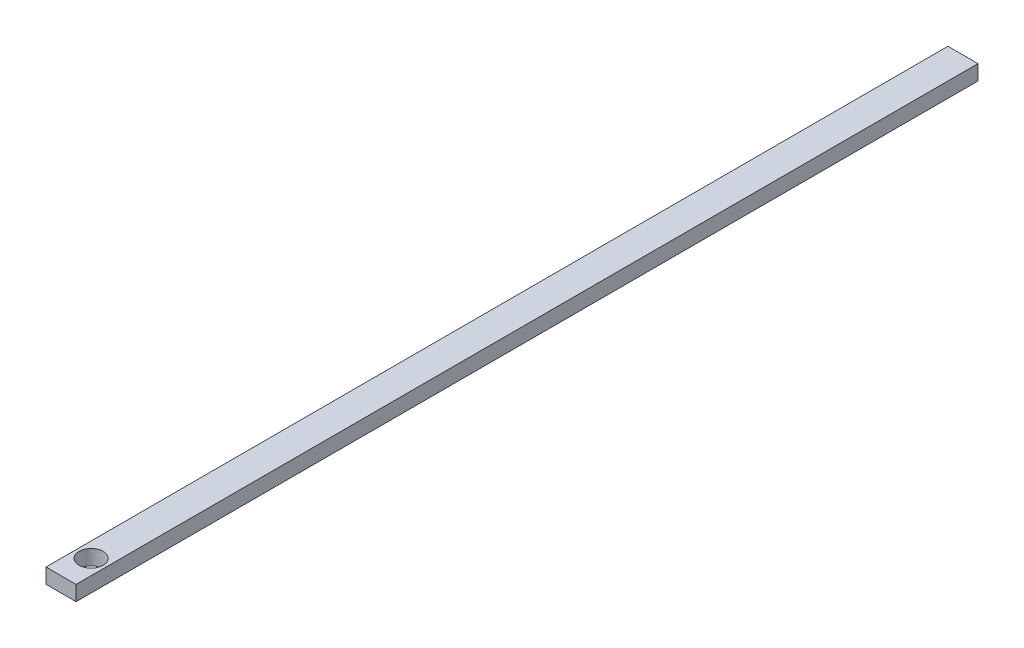
ISO-10303-21;
HEADER;
FILE_DESCRIPTION(('STEP AP214'),'2;1');
FILE_NAME('part.step','',(''),(''),'','','');
FILE_SCHEMA(('AUTOMOTIVE_DESIGN { 1 0 10303 214 1 1 1 1 }'));
ENDSEC;
DATA;
#1=APPLICATION_CONTEXT('core data for automotive mechanical design processes');
#2=APPLICATION_PROTOCOL_DEFINITION('international standard','automotive_design',2000,#1);
#3=PRODUCT_CONTEXT('',#1,'mechanical');
#4=PRODUCT('Part','Part','',(#3));
#5=PRODUCT_RELATED_PRODUCT_CATEGORY('part','',(#4));
#6=PRODUCT_DEFINITION_FORMATION('','',#4);
#7=PRODUCT_DEFINITION_CONTEXT('part definition',#1,'design');
#8=PRODUCT_DEFINITION('design','',#6,#7);
#9=PRODUCT_DEFINITION_SHAPE('','',#8);
#10=(LENGTH_UNIT() NAMED_UNIT(*) SI_UNIT(.MILLI.,.METRE.));
#11=(NAMED_UNIT(*) PLANE_ANGLE_UNIT() SI_UNIT($,.RADIAN.));
#12=(NAMED_UNIT(*) SI_UNIT($,.STERADIAN.) SOLID_ANGLE_UNIT());
#13=UNCERTAINTY_MEASURE_WITH_UNIT(LENGTH_MEASURE(1.E-05),#10,'distance_accuracy_value','');
#14=(GEOMETRIC_REPRESENTATION_CONTEXT(3) GLOBAL_UNCERTAINTY_ASSIGNED_CONTEXT((#13)) GLOBAL_UNIT_ASSIGNED_CONTEXT((#10,
#11,#12)) REPRESENTATION_CONTEXT('',''));
#15=CARTESIAN_POINT('',(0.,0.,0.));
#16=DIRECTION('',(0.,0.,1.));
#17=DIRECTION('',(1.,0.,0.));
#18=AXIS2_PLACEMENT_3D('',#15,#16,#17);
#19=CARTESIAN_POINT('',(10.,-2.5,150.));
#20=DIRECTION('',(0.,0.,1.));
#21=DIRECTION('',(1.,0.,0.));
#22=AXIS2_PLACEMENT_3D('',#19,#20,#21);
#23=PLANE('',#22);
#24=DIRECTION('',(0.,1.,0.));
#25=VECTOR('',#24,1.);
#26=CARTESIAN_POINT('',(0.,-2.5,150.));
#27=LINE('',#26,#25);
#28=CARTESIAN_POINT('',(0.,-2.5,150.));
#29=VERTEX_POINT('',#28);
#30=CARTESIAN_POINT('',(0.,2.5,150.));
#31=VERTEX_POINT('',#30);
#32=EDGE_CURVE('E105',#29,#31,#27,.T.);
#33=ORIENTED_EDGE('',*,*,#32,.F.);
#34=DIRECTION('',(-1.,0.,0.));
#35=VECTOR('',#34,1.);
#36=CARTESIAN_POINT('',(10.,-2.5,150.));
#37=LINE('',#36,#35);
#38=CARTESIAN_POINT('',(10.,-2.5,150.));
#39=VERTEX_POINT('',#38);
#40=EDGE_CURVE('E11',#39,#29,#37,.T.);
#41=ORIENTED_EDGE('',*,*,#40,.F.);
#42=DIRECTION('',(0.,1.,0.));
#43=VECTOR('',#42,1.);
#44=CARTESIAN_POINT('',(10.,-2.5,150.));
#45=LINE('',#44,#43);
#46=CARTESIAN_POINT('',(10.,2.5,150.));
#47=VERTEX_POINT('',#46);
#48=EDGE_CURVE('E99',#39,#47,#45,.T.);
#49=ORIENTED_EDGE('',*,*,#48,.T.);
#50=DIRECTION('',(-1.,0.,0.));
#51=VECTOR('',#50,1.);
#52=CARTESIAN_POINT('',(10.,2.5,150.));
#53=LINE('',#52,#51);
#54=EDGE_CURVE('E42',#47,#31,#53,.T.);
#55=ORIENTED_EDGE('',*,*,#54,.T.);
#56=EDGE_LOOP('',(#33,#41,#49,#55));
#57=FACE_BOUND('',#56,.T.);
#58=ADVANCED_FACE('F39',(#57),#23,.T.);
#59=CARTESIAN_POINT('',(10.,-2.5,150.));
#60=DIRECTION('',(0.,1.,0.));
#61=DIRECTION('',(0.,0.,1.));
#62=AXIS2_PLACEMENT_3D('',#59,#60,#61);
#63=PLANE('',#62);
#64=CARTESIAN_POINT('',(5.,-2.5,140.));
#65=DIRECTION('',(0.,1.,0.));
#66=DIRECTION('',(0.,0.,1.));
#67=AXIS2_PLACEMENT_3D('',#64,#65,#66);
#68=CIRCLE('',#67,4.);
#69=CARTESIAN_POINT('',(5.,-2.5,144.));
#70=VERTEX_POINT('',#69);
#71=EDGE_CURVE('E109',#70,#70,#68,.T.);
#72=ORIENTED_EDGE('',*,*,#71,.T.);
#73=EDGE_LOOP('',(#72));
#74=FACE_BOUND('',#73,.T.);
#75=DIRECTION('',(0.,0.,-1.));
#76=VECTOR('',#75,1.);
#77=CARTESIAN_POINT('',(0.,-2.5,150.));
#78=LINE('',#77,#76);
#79=CARTESIAN_POINT('',(0.,-2.5,-150.));
#80=VERTEX_POINT('',#79);
#81=EDGE_CURVE('E72',#29,#80,#78,.T.);
#82=ORIENTED_EDGE('',*,*,#81,.T.);
#83=DIRECTION('',(-1.,0.,0.));
#84=VECTOR('',#83,1.);
#85=CARTESIAN_POINT('',(10.,-2.5,-150.));
#86=LINE('',#85,#84);
#87=CARTESIAN_POINT('',(10.,-2.5,-150.));
#88=VERTEX_POINT('',#87);
#89=EDGE_CURVE('E48',#88,#80,#86,.T.);
#90=ORIENTED_EDGE('',*,*,#89,.F.);
#91=DIRECTION('',(0.,0.,-1.));
#92=VECTOR('',#91,1.);
#93=CARTESIAN_POINT('',(10.,-2.5,150.));
#94=LINE('',#93,#92);
#95=EDGE_CURVE('E89',#39,#88,#94,.T.);
#96=ORIENTED_EDGE('',*,*,#95,.F.);
#97=ORIENTED_EDGE('',*,*,#40,.T.);
#98=EDGE_LOOP('',(#82,#90,#96,#97));
#99=FACE_BOUND('',#98,.T.);
#100=ADVANCED_FACE('F116',(#74,#99),#63,.F.);
#101=CARTESIAN_POINT('',(10.,-2.5,-150.));
#102=DIRECTION('',(0.,0.,1.));
#103=DIRECTION('',(1.,0.,0.));
#104=AXIS2_PLACEMENT_3D('',#101,#102,#103);
#105=PLANE('',#104);
#106=DIRECTION('',(0.,1.,0.));
#107=VECTOR('',#106,1.);
#108=CARTESIAN_POINT('',(0.,-2.5,-150.));
#109=LINE('',#108,#107);
#110=CARTESIAN_POINT('',(0.,2.5,-150.));
#111=VERTEX_POINT('',#110);
#112=EDGE_CURVE('E96',#80,#111,#109,.T.);
#113=ORIENTED_EDGE('',*,*,#112,.T.);
#114=DIRECTION('',(-1.,0.,0.));
#115=VECTOR('',#114,1.);
#116=CARTESIAN_POINT('',(10.,2.5,-150.));
#117=LINE('',#116,#115);
#118=CARTESIAN_POINT('',(10.,2.5,-150.));
#119=VERTEX_POINT('',#118);
#120=EDGE_CURVE('E93',#119,#111,#117,.T.);
#121=ORIENTED_EDGE('',*,*,#120,.F.);
#122=DIRECTION('',(0.,1.,0.));
#123=VECTOR('',#122,1.);
#124=CARTESIAN_POINT('',(10.,-2.5,-150.));
#125=LINE('',#124,#123);
#126=EDGE_CURVE('E84',#88,#119,#125,.T.);
#127=ORIENTED_EDGE('',*,*,#126,.F.);
#128=ORIENTED_EDGE('',*,*,#89,.T.);
#129=EDGE_LOOP('',(#113,#121,#127,#128));
#130=FACE_BOUND('',#129,.T.);
#131=ADVANCED_FACE('F94',(#130),#105,.F.);
#132=CARTESIAN_POINT('',(10.,2.5,150.));
#133=DIRECTION('',(0.,1.,0.));
#134=DIRECTION('',(0.,0.,1.));
#135=AXIS2_PLACEMENT_3D('',#132,#133,#134);
#136=PLANE('',#135);
#137=CARTESIAN_POINT('',(5.,2.5,140.));
#138=DIRECTION('',(0.,1.,0.));
#139=DIRECTION('',(0.,0.,1.));
#140=AXIS2_PLACEMENT_3D('',#137,#138,#139);
#141=CIRCLE('',#140,4.);
#142=CARTESIAN_POINT('',(5.,2.5,144.));
#143=VERTEX_POINT('',#142);
#144=EDGE_CURVE('E138',#143,#143,#141,.T.);
#145=ORIENTED_EDGE('',*,*,#144,.F.);
#146=EDGE_LOOP('',(#145));
#147=FACE_BOUND('',#146,.T.);
#148=DIRECTION('',(0.,0.,-1.));
#149=VECTOR('',#148,1.);
#150=CARTESIAN_POINT('',(0.,2.5,150.));
#151=LINE('',#150,#149);
#152=EDGE_CURVE('E108',#31,#111,#151,.T.);
#153=ORIENTED_EDGE('',*,*,#152,.F.);
#154=ORIENTED_EDGE('',*,*,#54,.F.);
#155=DIRECTION('',(0.,0.,-1.));
#156=VECTOR('',#155,1.);
#157=CARTESIAN_POINT('',(10.,2.5,150.));
#158=LINE('',#157,#156);
#159=EDGE_CURVE('E88',#47,#119,#158,.T.);
#160=ORIENTED_EDGE('',*,*,#159,.T.);
#161=ORIENTED_EDGE('',*,*,#120,.T.);
#162=EDGE_LOOP('',(#153,#154,#160,#161));
#163=FACE_BOUND('',#162,.T.);
#164=ADVANCED_FACE('F98',(#147,#163),#136,.T.);
#165=CARTESIAN_POINT('',(10.,0.,0.));
#166=DIRECTION('',(-1.,0.,0.));
#167=DIRECTION('',(0.,0.,1.));
#168=AXIS2_PLACEMENT_3D('',#165,#166,#167);
#169=PLANE('',#168);
#170=ORIENTED_EDGE('',*,*,#48,.F.);
#171=ORIENTED_EDGE('',*,*,#95,.T.);
#172=ORIENTED_EDGE('',*,*,#126,.T.);
#173=ORIENTED_EDGE('',*,*,#159,.F.);
#174=EDGE_LOOP('',(#170,#171,#172,#173));
#175=FACE_BOUND('',#174,.T.);
#176=ADVANCED_FACE('F87',(#175),#169,.F.);
#177=CARTESIAN_POINT('',(0.,0.,0.));
#178=DIRECTION('',(-1.,0.,0.));
#179=DIRECTION('',(0.,0.,1.));
#180=AXIS2_PLACEMENT_3D('',#177,#178,#179);
#181=PLANE('',#180);
#182=ORIENTED_EDGE('',*,*,#32,.T.);
#183=ORIENTED_EDGE('',*,*,#152,.T.);
#184=ORIENTED_EDGE('',*,*,#112,.F.);
#185=ORIENTED_EDGE('',*,*,#81,.F.);
#186=EDGE_LOOP('',(#182,#183,#184,#185));
#187=FACE_BOUND('',#186,.T.);
#188=ADVANCED_FACE('F114',(#187),#181,.T.);
#189=CARTESIAN_POINT('',(5.,-2.5,140.));
#190=DIRECTION('',(0.,1.,0.));
#191=DIRECTION('',(0.,0.,1.));
#192=AXIS2_PLACEMENT_3D('',#189,#190,#191);
#193=CYLINDRICAL_SURFACE('',#192,4.);
#194=ORIENTED_EDGE('',*,*,#71,.F.);
#195=EDGE_LOOP('',(#194));
#196=FACE_BOUND('',#195,.T.);
#197=ORIENTED_EDGE('',*,*,#144,.T.);
#198=EDGE_LOOP('',(#197));
#199=FACE_BOUND('',#198,.T.);
#200=ADVANCED_FACE('F143',(#196,#199),#193,.F.);
#201=CLOSED_SHELL('',(#58,#100,#131,#164,#176,#188,#200));
#202=MANIFOLD_SOLID_BREP('B2',#201);
#203=ADVANCED_BREP_SHAPE_REPRESENTATION('',(#18,#202),#14);
#204=SHAPE_DEFINITION_REPRESENTATION(#9,#203);
ENDSEC;
END-ISO-10303-21;
